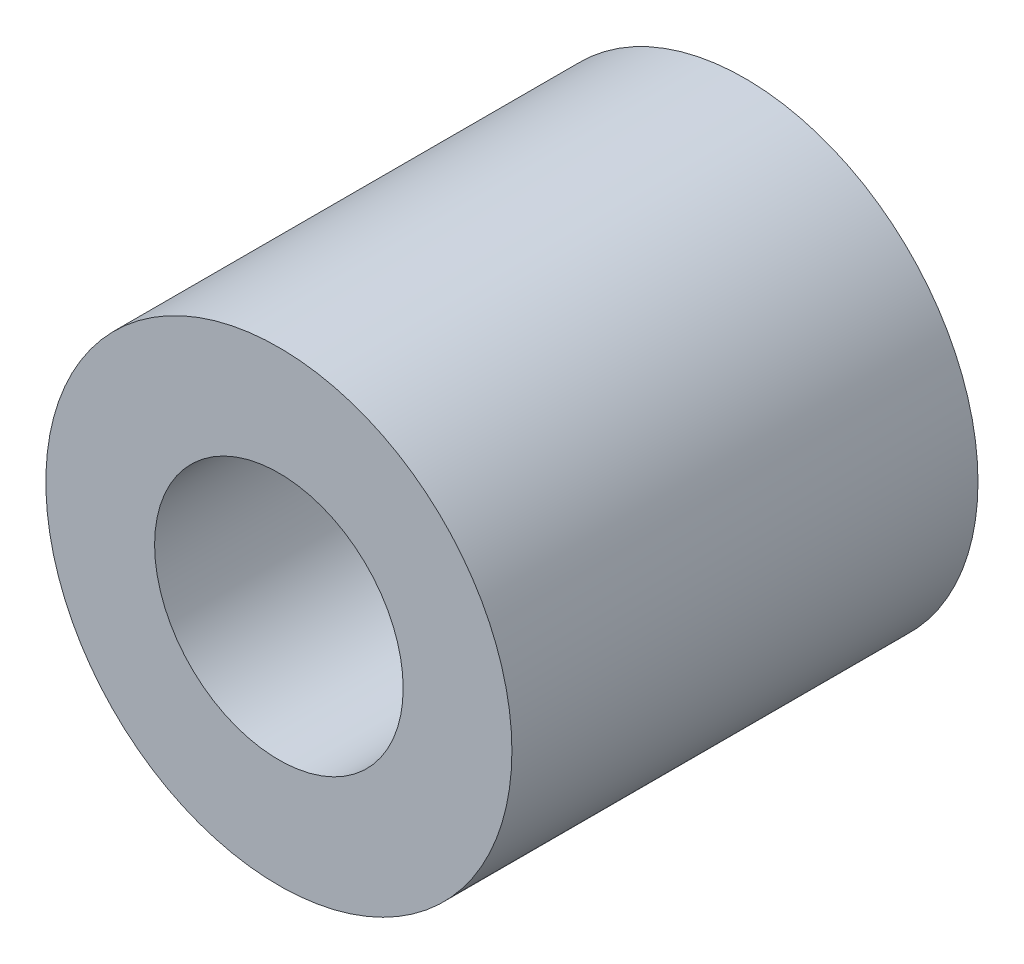
ISO-10303-21;
HEADER;
FILE_DESCRIPTION(('STEP AP214'),'2;1');
FILE_NAME('part.step','',(''),(''),'','','');
FILE_SCHEMA(('AUTOMOTIVE_DESIGN { 1 0 10303 214 1 1 1 1 }'));
ENDSEC;
DATA;
#1=APPLICATION_CONTEXT('core data for automotive mechanical design processes');
#2=APPLICATION_PROTOCOL_DEFINITION('international standard','automotive_design',2000,#1);
#3=PRODUCT_CONTEXT('',#1,'mechanical');
#4=PRODUCT('Part','Part','',(#3));
#5=PRODUCT_RELATED_PRODUCT_CATEGORY('part','',(#4));
#6=PRODUCT_DEFINITION_FORMATION('','',#4);
#7=PRODUCT_DEFINITION_CONTEXT('part definition',#1,'design');
#8=PRODUCT_DEFINITION('design','',#6,#7);
#9=PRODUCT_DEFINITION_SHAPE('','',#8);
#10=(LENGTH_UNIT() NAMED_UNIT(*) SI_UNIT(.MILLI.,.METRE.));
#11=(NAMED_UNIT(*) PLANE_ANGLE_UNIT() SI_UNIT($,.RADIAN.));
#12=(NAMED_UNIT(*) SI_UNIT($,.STERADIAN.) SOLID_ANGLE_UNIT());
#13=UNCERTAINTY_MEASURE_WITH_UNIT(LENGTH_MEASURE(1.E-05),#10,'distance_accuracy_value','');
#14=(GEOMETRIC_REPRESENTATION_CONTEXT(3) GLOBAL_UNCERTAINTY_ASSIGNED_CONTEXT((#13)) GLOBAL_UNIT_ASSIGNED_CONTEXT((#10,
#11,#12)) REPRESENTATION_CONTEXT('',''));
#15=CARTESIAN_POINT('',(0.,0.,0.));
#16=DIRECTION('',(0.,0.,1.));
#17=DIRECTION('',(1.,0.,0.));
#18=AXIS2_PLACEMENT_3D('',#15,#16,#17);
#19=CARTESIAN_POINT('',(0.,0.,3.));
#20=DIRECTION('',(0.,0.,1.));
#21=DIRECTION('',(1.,0.,0.));
#22=AXIS2_PLACEMENT_3D('',#19,#20,#21);
#23=PLANE('',#22);
#24=CARTESIAN_POINT('',(0.,0.,3.));
#25=DIRECTION('',(0.,0.,1.));
#26=DIRECTION('',(1.,0.,0.));
#27=AXIS2_PLACEMENT_3D('',#24,#25,#26);
#28=CIRCLE('',#27,3.);
#29=CARTESIAN_POINT('',(3.,0.,3.));
#30=VERTEX_POINT('',#29);
#31=EDGE_CURVE('E10',#30,#30,#28,.T.);
#32=ORIENTED_EDGE('',*,*,#31,.T.);
#33=EDGE_LOOP('',(#32));
#34=FACE_BOUND('',#33,.T.);
#35=CARTESIAN_POINT('',(0.,0.,3.));
#36=DIRECTION('',(0.,0.,1.));
#37=DIRECTION('',(1.,0.,0.));
#38=AXIS2_PLACEMENT_3D('',#35,#36,#37);
#39=CIRCLE('',#38,1.6);
#40=CARTESIAN_POINT('',(1.6,0.,3.));
#41=VERTEX_POINT('',#40);
#42=EDGE_CURVE('E54',#41,#41,#39,.T.);
#43=ORIENTED_EDGE('',*,*,#42,.F.);
#44=EDGE_LOOP('',(#43));
#45=FACE_BOUND('',#44,.T.);
#46=ADVANCED_FACE('F40',(#34,#45),#23,.T.);
#47=CARTESIAN_POINT('',(0.,0.,-3.));
#48=DIRECTION('',(0.,0.,1.));
#49=DIRECTION('',(1.,0.,0.));
#50=AXIS2_PLACEMENT_3D('',#47,#48,#49);
#51=PLANE('',#50);
#52=CARTESIAN_POINT('',(0.,0.,-3.));
#53=DIRECTION('',(0.,0.,1.));
#54=DIRECTION('',(1.,0.,0.));
#55=AXIS2_PLACEMENT_3D('',#52,#53,#54);
#56=CIRCLE('',#55,3.);
#57=CARTESIAN_POINT('',(3.,0.,-3.));
#58=VERTEX_POINT('',#57);
#59=EDGE_CURVE('E44',#58,#58,#56,.T.);
#60=ORIENTED_EDGE('',*,*,#59,.F.);
#61=EDGE_LOOP('',(#60));
#62=FACE_BOUND('',#61,.T.);
#63=CARTESIAN_POINT('',(0.,0.,-3.));
#64=DIRECTION('',(0.,0.,1.));
#65=DIRECTION('',(1.,0.,0.));
#66=AXIS2_PLACEMENT_3D('',#63,#64,#65);
#67=CIRCLE('',#66,1.6);
#68=CARTESIAN_POINT('',(1.6,0.,-3.));
#69=VERTEX_POINT('',#68);
#70=EDGE_CURVE('E56',#69,#69,#67,.T.);
#71=ORIENTED_EDGE('',*,*,#70,.T.);
#72=EDGE_LOOP('',(#71));
#73=FACE_BOUND('',#72,.T.);
#74=ADVANCED_FACE('F69',(#62,#73),#51,.F.);
#75=CARTESIAN_POINT('',(0.,0.,3.));
#76=DIRECTION('',(0.,0.,-1.));
#77=DIRECTION('',(-1.,0.,0.));
#78=AXIS2_PLACEMENT_3D('',#75,#76,#77);
#79=CYLINDRICAL_SURFACE('',#78,3.);
#80=ORIENTED_EDGE('',*,*,#31,.F.);
#81=EDGE_LOOP('',(#80));
#82=FACE_BOUND('',#81,.T.);
#83=ORIENTED_EDGE('',*,*,#59,.T.);
#84=EDGE_LOOP('',(#83));
#85=FACE_BOUND('',#84,.T.);
#86=ADVANCED_FACE('F42',(#82,#85),#79,.T.);
#87=CARTESIAN_POINT('',(0.,0.,3.));
#88=DIRECTION('',(0.,0.,-1.));
#89=DIRECTION('',(-1.,0.,0.));
#90=AXIS2_PLACEMENT_3D('',#87,#88,#89);
#91=CYLINDRICAL_SURFACE('',#90,1.6);
#92=ORIENTED_EDGE('',*,*,#42,.T.);
#93=EDGE_LOOP('',(#92));
#94=FACE_BOUND('',#93,.T.);
#95=ORIENTED_EDGE('',*,*,#70,.F.);
#96=EDGE_LOOP('',(#95));
#97=FACE_BOUND('',#96,.T.);
#98=ADVANCED_FACE('F65',(#94,#97),#91,.F.);
#99=CLOSED_SHELL('',(#46,#74,#86,#98));
#100=MANIFOLD_SOLID_BREP('B2',#99);
#101=ADVANCED_BREP_SHAPE_REPRESENTATION('',(#18,#100),#14);
#102=SHAPE_DEFINITION_REPRESENTATION(#9,#101);
ENDSEC;
END-ISO-10303-21;
